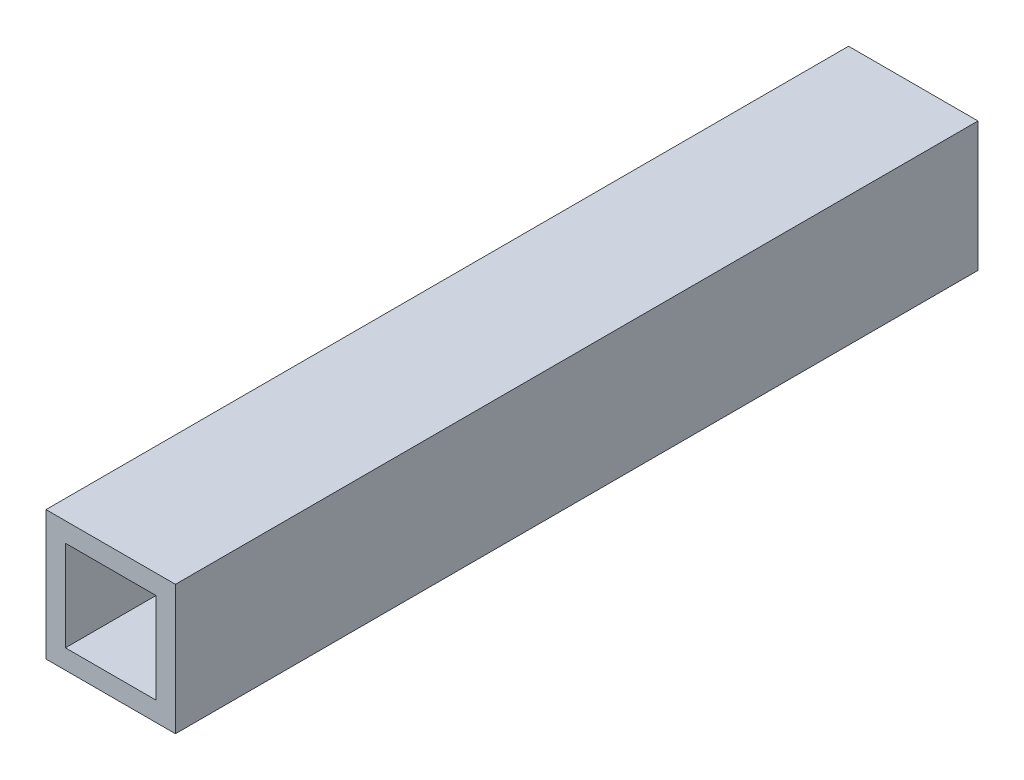
ISO-10303-21;
HEADER;
FILE_DESCRIPTION(('STEP AP214'),'2;1');
FILE_NAME('part.step','',(''),(''),'','','');
FILE_SCHEMA(('AUTOMOTIVE_DESIGN { 1 0 10303 214 1 1 1 1 }'));
ENDSEC;
DATA;
#1=APPLICATION_CONTEXT('core data for automotive mechanical design processes');
#2=APPLICATION_PROTOCOL_DEFINITION('international standard','automotive_design',2000,#1);
#3=PRODUCT_CONTEXT('',#1,'mechanical');
#4=PRODUCT('Part','Part','',(#3));
#5=PRODUCT_RELATED_PRODUCT_CATEGORY('part','',(#4));
#6=PRODUCT_DEFINITION_FORMATION('','',#4);
#7=PRODUCT_DEFINITION_CONTEXT('part definition',#1,'design');
#8=PRODUCT_DEFINITION('design','',#6,#7);
#9=PRODUCT_DEFINITION_SHAPE('','',#8);
#10=(LENGTH_UNIT() NAMED_UNIT(*) SI_UNIT(.MILLI.,.METRE.));
#11=(NAMED_UNIT(*) PLANE_ANGLE_UNIT() SI_UNIT($,.RADIAN.));
#12=(NAMED_UNIT(*) SI_UNIT($,.STERADIAN.) SOLID_ANGLE_UNIT());
#13=UNCERTAINTY_MEASURE_WITH_UNIT(LENGTH_MEASURE(1.E-05),#10,'distance_accuracy_value','');
#14=(GEOMETRIC_REPRESENTATION_CONTEXT(3) GLOBAL_UNCERTAINTY_ASSIGNED_CONTEXT((#13)) GLOBAL_UNIT_ASSIGNED_CONTEXT((#10,
#11,#12)) REPRESENTATION_CONTEXT('',''));
#15=CARTESIAN_POINT('',(0.,0.,0.));
#16=DIRECTION('',(0.,0.,1.));
#17=DIRECTION('',(1.,0.,0.));
#18=AXIS2_PLACEMENT_3D('',#15,#16,#17);
#19=CARTESIAN_POINT('',(0.,0.,62.));
#20=DIRECTION('',(0.,0.,1.));
#21=DIRECTION('',(1.,0.,0.));
#22=AXIS2_PLACEMENT_3D('',#19,#20,#21);
#23=PLANE('',#22);
#24=DIRECTION('',(0.,1.,0.));
#25=VECTOR('',#24,1.);
#26=CARTESIAN_POINT('',(5.,5.,62.));
#27=LINE('',#26,#25);
#28=CARTESIAN_POINT('',(5.,-5.,62.));
#29=VERTEX_POINT('',#28);
#30=CARTESIAN_POINT('',(5.,5.,62.));
#31=VERTEX_POINT('',#30);
#32=EDGE_CURVE('E134',#29,#31,#27,.T.);
#33=ORIENTED_EDGE('',*,*,#32,.T.);
#34=DIRECTION('',(-1.,0.,0.));
#35=VECTOR('',#34,1.);
#36=CARTESIAN_POINT('',(-5.,5.,62.));
#37=LINE('',#36,#35);
#38=CARTESIAN_POINT('',(-5.,5.,62.));
#39=VERTEX_POINT('',#38);
#40=EDGE_CURVE('E137',#31,#39,#37,.T.);
#41=ORIENTED_EDGE('',*,*,#40,.T.);
#42=DIRECTION('',(0.,-1.,0.));
#43=VECTOR('',#42,1.);
#44=CARTESIAN_POINT('',(-5.,5.,62.));
#45=LINE('',#44,#43);
#46=CARTESIAN_POINT('',(-5.,-5.,62.));
#47=VERTEX_POINT('',#46);
#48=EDGE_CURVE('E140',#39,#47,#45,.T.);
#49=ORIENTED_EDGE('',*,*,#48,.T.);
#50=DIRECTION('',(1.,0.,0.));
#51=VECTOR('',#50,1.);
#52=CARTESIAN_POINT('',(-5.,-5.,62.));
#53=LINE('',#52,#51);
#54=EDGE_CURVE('E142',#47,#29,#53,.T.);
#55=ORIENTED_EDGE('',*,*,#54,.T.);
#56=EDGE_LOOP('',(#33,#41,#49,#55));
#57=FACE_BOUND('',#56,.T.);
#58=DIRECTION('',(-1.,0.,0.));
#59=VECTOR('',#58,1.);
#60=CARTESIAN_POINT('',(-3.5,3.5,62.));
#61=LINE('',#60,#59);
#62=CARTESIAN_POINT('',(3.5,3.5,62.));
#63=VERTEX_POINT('',#62);
#64=CARTESIAN_POINT('',(-3.5,3.5,62.));
#65=VERTEX_POINT('',#64);
#66=EDGE_CURVE('E106',#63,#65,#61,.T.);
#67=ORIENTED_EDGE('',*,*,#66,.F.);
#68=DIRECTION('',(0.,1.,0.));
#69=VECTOR('',#68,1.);
#70=CARTESIAN_POINT('',(3.5,-3.5,62.));
#71=LINE('',#70,#69);
#72=CARTESIAN_POINT('',(3.5,-3.5,62.));
#73=VERTEX_POINT('',#72);
#74=EDGE_CURVE('E98',#73,#63,#71,.T.);
#75=ORIENTED_EDGE('',*,*,#74,.F.);
#76=DIRECTION('',(1.,0.,0.));
#77=VECTOR('',#76,1.);
#78=CARTESIAN_POINT('',(-3.5,-3.5,62.));
#79=LINE('',#78,#77);
#80=CARTESIAN_POINT('',(-3.5,-3.5,62.));
#81=VERTEX_POINT('',#80);
#82=EDGE_CURVE('E120',#81,#73,#79,.T.);
#83=ORIENTED_EDGE('',*,*,#82,.F.);
#84=DIRECTION('',(0.,-1.,0.));
#85=VECTOR('',#84,1.);
#86=CARTESIAN_POINT('',(-3.5,-3.5,62.));
#87=LINE('',#86,#85);
#88=EDGE_CURVE('E118',#65,#81,#87,.T.);
#89=ORIENTED_EDGE('',*,*,#88,.F.);
#90=EDGE_LOOP('',(#67,#75,#83,#89));
#91=FACE_BOUND('',#90,.T.);
#92=ADVANCED_FACE('F33',(#57,#91),#23,.T.);
#93=CARTESIAN_POINT('',(0.,0.,0.));
#94=DIRECTION('',(0.,0.,1.));
#95=DIRECTION('',(1.,0.,0.));
#96=AXIS2_PLACEMENT_3D('',#93,#94,#95);
#97=PLANE('',#96);
#98=DIRECTION('',(0.,1.,0.));
#99=VECTOR('',#98,1.);
#100=CARTESIAN_POINT('',(5.,5.,0.));
#101=LINE('',#100,#99);
#102=CARTESIAN_POINT('',(5.,-5.,0.));
#103=VERTEX_POINT('',#102);
#104=CARTESIAN_POINT('',(5.,5.,0.));
#105=VERTEX_POINT('',#104);
#106=EDGE_CURVE('E114',#103,#105,#101,.T.);
#107=ORIENTED_EDGE('',*,*,#106,.F.);
#108=DIRECTION('',(1.,0.,0.));
#109=VECTOR('',#108,1.);
#110=CARTESIAN_POINT('',(-5.,-5.,0.));
#111=LINE('',#110,#109);
#112=CARTESIAN_POINT('',(-5.,-5.,0.));
#113=VERTEX_POINT('',#112);
#114=EDGE_CURVE('E138',#113,#103,#111,.T.);
#115=ORIENTED_EDGE('',*,*,#114,.F.);
#116=DIRECTION('',(0.,-1.,0.));
#117=VECTOR('',#116,1.);
#118=CARTESIAN_POINT('',(-5.,5.,0.));
#119=LINE('',#118,#117);
#120=CARTESIAN_POINT('',(-5.,5.,0.));
#121=VERTEX_POINT('',#120);
#122=EDGE_CURVE('E149',#121,#113,#119,.T.);
#123=ORIENTED_EDGE('',*,*,#122,.F.);
#124=DIRECTION('',(-1.,0.,0.));
#125=VECTOR('',#124,1.);
#126=CARTESIAN_POINT('',(-5.,5.,0.));
#127=LINE('',#126,#125);
#128=EDGE_CURVE('E147',#105,#121,#127,.T.);
#129=ORIENTED_EDGE('',*,*,#128,.F.);
#130=EDGE_LOOP('',(#107,#115,#123,#129));
#131=FACE_BOUND('',#130,.T.);
#132=DIRECTION('',(0.,1.,0.));
#133=VECTOR('',#132,1.);
#134=CARTESIAN_POINT('',(3.5,-3.5,0.));
#135=LINE('',#134,#133);
#136=CARTESIAN_POINT('',(3.5,-3.5,0.));
#137=VERTEX_POINT('',#136);
#138=CARTESIAN_POINT('',(3.5,3.5,0.));
#139=VERTEX_POINT('',#138);
#140=EDGE_CURVE('E56',#137,#139,#135,.T.);
#141=ORIENTED_EDGE('',*,*,#140,.T.);
#142=DIRECTION('',(-1.,0.,0.));
#143=VECTOR('',#142,1.);
#144=CARTESIAN_POINT('',(-3.5,3.5,0.));
#145=LINE('',#144,#143);
#146=CARTESIAN_POINT('',(-3.5,3.5,0.));
#147=VERTEX_POINT('',#146);
#148=EDGE_CURVE('E113',#139,#147,#145,.T.);
#149=ORIENTED_EDGE('',*,*,#148,.T.);
#150=DIRECTION('',(0.,-1.,0.));
#151=VECTOR('',#150,1.);
#152=CARTESIAN_POINT('',(-3.5,-3.5,0.));
#153=LINE('',#152,#151);
#154=CARTESIAN_POINT('',(-3.5,-3.5,0.));
#155=VERTEX_POINT('',#154);
#156=EDGE_CURVE('E126',#147,#155,#153,.T.);
#157=ORIENTED_EDGE('',*,*,#156,.T.);
#158=DIRECTION('',(1.,0.,0.));
#159=VECTOR('',#158,1.);
#160=CARTESIAN_POINT('',(-3.5,-3.5,0.));
#161=LINE('',#160,#159);
#162=EDGE_CURVE('E107',#155,#137,#161,.T.);
#163=ORIENTED_EDGE('',*,*,#162,.T.);
#164=EDGE_LOOP('',(#141,#149,#157,#163));
#165=FACE_BOUND('',#164,.T.);
#166=ADVANCED_FACE('F167',(#131,#165),#97,.F.);
#167=CARTESIAN_POINT('',(5.,5.,62.));
#168=DIRECTION('',(-1.,0.,0.));
#169=DIRECTION('',(0.,-1.,0.));
#170=AXIS2_PLACEMENT_3D('',#167,#168,#169);
#171=PLANE('',#170);
#172=ORIENTED_EDGE('',*,*,#106,.T.);
#173=DIRECTION('',(0.,0.,-1.));
#174=VECTOR('',#173,1.);
#175=CARTESIAN_POINT('',(5.,5.,62.));
#176=LINE('',#175,#174);
#177=EDGE_CURVE('E11',#31,#105,#176,.T.);
#178=ORIENTED_EDGE('',*,*,#177,.F.);
#179=ORIENTED_EDGE('',*,*,#32,.F.);
#180=DIRECTION('',(0.,0.,-1.));
#181=VECTOR('',#180,1.);
#182=CARTESIAN_POINT('',(5.,-5.,62.));
#183=LINE('',#182,#181);
#184=EDGE_CURVE('E144',#29,#103,#183,.T.);
#185=ORIENTED_EDGE('',*,*,#184,.T.);
#186=EDGE_LOOP('',(#172,#178,#179,#185));
#187=FACE_BOUND('',#186,.T.);
#188=ADVANCED_FACE('F35',(#187),#171,.F.);
#189=CARTESIAN_POINT('',(-5.,5.,62.));
#190=DIRECTION('',(0.,-1.,0.));
#191=DIRECTION('',(0.,0.,-1.));
#192=AXIS2_PLACEMENT_3D('',#189,#190,#191);
#193=PLANE('',#192);
#194=ORIENTED_EDGE('',*,*,#128,.T.);
#195=DIRECTION('',(0.,0.,-1.));
#196=VECTOR('',#195,1.);
#197=CARTESIAN_POINT('',(-5.,5.,62.));
#198=LINE('',#197,#196);
#199=EDGE_CURVE('E41',#39,#121,#198,.T.);
#200=ORIENTED_EDGE('',*,*,#199,.F.);
#201=ORIENTED_EDGE('',*,*,#40,.F.);
#202=ORIENTED_EDGE('',*,*,#177,.T.);
#203=EDGE_LOOP('',(#194,#200,#201,#202));
#204=FACE_BOUND('',#203,.T.);
#205=ADVANCED_FACE('F177',(#204),#193,.F.);
#206=CARTESIAN_POINT('',(-5.,5.,62.));
#207=DIRECTION('',(1.,0.,0.));
#208=DIRECTION('',(0.,1.,0.));
#209=AXIS2_PLACEMENT_3D('',#206,#207,#208);
#210=PLANE('',#209);
#211=ORIENTED_EDGE('',*,*,#122,.T.);
#212=DIRECTION('',(0.,0.,-1.));
#213=VECTOR('',#212,1.);
#214=CARTESIAN_POINT('',(-5.,-5.,62.));
#215=LINE('',#214,#213);
#216=EDGE_CURVE('E154',#47,#113,#215,.T.);
#217=ORIENTED_EDGE('',*,*,#216,.F.);
#218=ORIENTED_EDGE('',*,*,#48,.F.);
#219=ORIENTED_EDGE('',*,*,#199,.T.);
#220=EDGE_LOOP('',(#211,#217,#218,#219));
#221=FACE_BOUND('',#220,.T.);
#222=ADVANCED_FACE('F161',(#221),#210,.F.);
#223=CARTESIAN_POINT('',(-5.,-5.,62.));
#224=DIRECTION('',(0.,1.,0.));
#225=DIRECTION('',(0.,0.,1.));
#226=AXIS2_PLACEMENT_3D('',#223,#224,#225);
#227=PLANE('',#226);
#228=ORIENTED_EDGE('',*,*,#114,.T.);
#229=ORIENTED_EDGE('',*,*,#184,.F.);
#230=ORIENTED_EDGE('',*,*,#54,.F.);
#231=ORIENTED_EDGE('',*,*,#216,.T.);
#232=EDGE_LOOP('',(#228,#229,#230,#231));
#233=FACE_BOUND('',#232,.T.);
#234=ADVANCED_FACE('F171',(#233),#227,.F.);
#235=CARTESIAN_POINT('',(3.5,-3.5,62.));
#236=DIRECTION('',(-1.,0.,0.));
#237=DIRECTION('',(0.,0.,1.));
#238=AXIS2_PLACEMENT_3D('',#235,#236,#237);
#239=PLANE('',#238);
#240=ORIENTED_EDGE('',*,*,#140,.F.);
#241=DIRECTION('',(0.,0.,-1.));
#242=VECTOR('',#241,1.);
#243=CARTESIAN_POINT('',(3.5,-3.5,62.));
#244=LINE('',#243,#242);
#245=EDGE_CURVE('E102',#73,#137,#244,.T.);
#246=ORIENTED_EDGE('',*,*,#245,.F.);
#247=ORIENTED_EDGE('',*,*,#74,.T.);
#248=DIRECTION('',(0.,0.,-1.));
#249=VECTOR('',#248,1.);
#250=CARTESIAN_POINT('',(3.5,3.5,62.));
#251=LINE('',#250,#249);
#252=EDGE_CURVE('E101',#63,#139,#251,.T.);
#253=ORIENTED_EDGE('',*,*,#252,.T.);
#254=EDGE_LOOP('',(#240,#246,#247,#253));
#255=FACE_BOUND('',#254,.T.);
#256=ADVANCED_FACE('F100',(#255),#239,.T.);
#257=CARTESIAN_POINT('',(-3.5,3.5,62.));
#258=DIRECTION('',(0.,-1.,0.));
#259=DIRECTION('',(0.,0.,-1.));
#260=AXIS2_PLACEMENT_3D('',#257,#258,#259);
#261=PLANE('',#260);
#262=ORIENTED_EDGE('',*,*,#148,.F.);
#263=ORIENTED_EDGE('',*,*,#252,.F.);
#264=ORIENTED_EDGE('',*,*,#66,.T.);
#265=DIRECTION('',(0.,0.,-1.));
#266=VECTOR('',#265,1.);
#267=CARTESIAN_POINT('',(-3.5,3.5,62.));
#268=LINE('',#267,#266);
#269=EDGE_CURVE('E115',#65,#147,#268,.T.);
#270=ORIENTED_EDGE('',*,*,#269,.T.);
#271=EDGE_LOOP('',(#262,#263,#264,#270));
#272=FACE_BOUND('',#271,.T.);
#273=ADVANCED_FACE('F110',(#272),#261,.T.);
#274=CARTESIAN_POINT('',(-3.5,-3.5,62.));
#275=DIRECTION('',(1.,0.,0.));
#276=DIRECTION('',(0.,0.,-1.));
#277=AXIS2_PLACEMENT_3D('',#274,#275,#276);
#278=PLANE('',#277);
#279=ORIENTED_EDGE('',*,*,#156,.F.);
#280=ORIENTED_EDGE('',*,*,#269,.F.);
#281=ORIENTED_EDGE('',*,*,#88,.T.);
#282=DIRECTION('',(0.,0.,-1.));
#283=VECTOR('',#282,1.);
#284=CARTESIAN_POINT('',(-3.5,-3.5,62.));
#285=LINE('',#284,#283);
#286=EDGE_CURVE('E48',#81,#155,#285,.T.);
#287=ORIENTED_EDGE('',*,*,#286,.T.);
#288=EDGE_LOOP('',(#279,#280,#281,#287));
#289=FACE_BOUND('',#288,.T.);
#290=ADVANCED_FACE('F200',(#289),#278,.T.);
#291=CARTESIAN_POINT('',(-3.5,-3.5,62.));
#292=DIRECTION('',(0.,1.,0.));
#293=DIRECTION('',(0.,0.,1.));
#294=AXIS2_PLACEMENT_3D('',#291,#292,#293);
#295=PLANE('',#294);
#296=ORIENTED_EDGE('',*,*,#162,.F.);
#297=ORIENTED_EDGE('',*,*,#286,.F.);
#298=ORIENTED_EDGE('',*,*,#82,.T.);
#299=ORIENTED_EDGE('',*,*,#245,.T.);
#300=EDGE_LOOP('',(#296,#297,#298,#299));
#301=FACE_BOUND('',#300,.T.);
#302=ADVANCED_FACE('F204',(#301),#295,.T.);
#303=CLOSED_SHELL('',(#92,#166,#188,#205,#222,#234,#256,#273,#290,#302));
#304=MANIFOLD_SOLID_BREP('B2',#303);
#305=ADVANCED_BREP_SHAPE_REPRESENTATION('',(#18,#304),#14);
#306=SHAPE_DEFINITION_REPRESENTATION(#9,#305);
ENDSEC;
END-ISO-10303-21;
